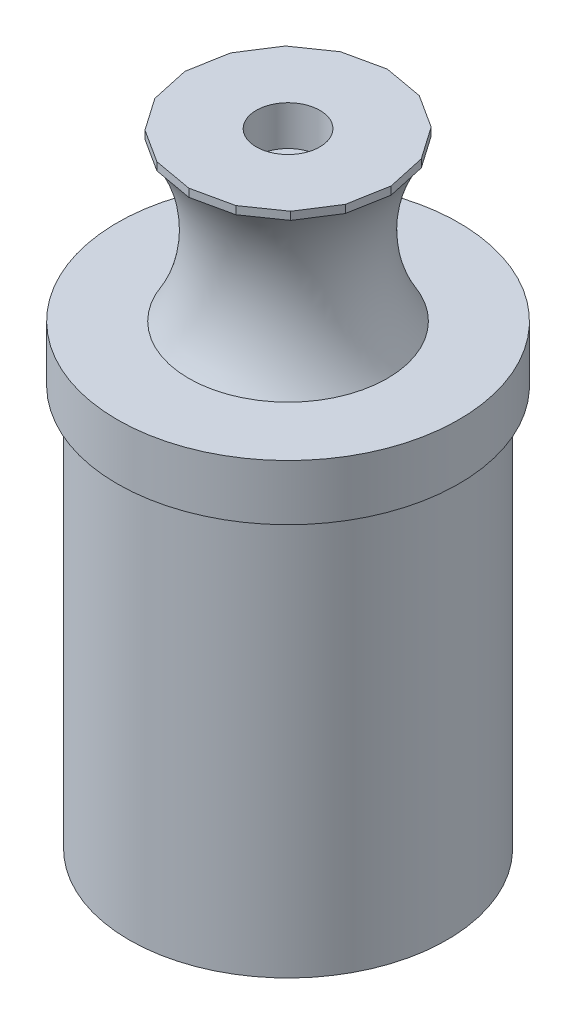
ISO-10303-21;
HEADER;
FILE_DESCRIPTION(('STEP AP214'),'2;1');
FILE_NAME('part.step','',(''),(''),'','','');
FILE_SCHEMA(('AUTOMOTIVE_DESIGN { 1 0 10303 214 1 1 1 1 }'));
ENDSEC;
DATA;
#1=APPLICATION_CONTEXT('core data for automotive mechanical design processes');
#2=APPLICATION_PROTOCOL_DEFINITION('international standard','automotive_design',2000,#1);
#3=PRODUCT_CONTEXT('',#1,'mechanical');
#4=PRODUCT('Part','Part','',(#3));
#5=PRODUCT_RELATED_PRODUCT_CATEGORY('part','',(#4));
#6=PRODUCT_DEFINITION_FORMATION('','',#4);
#7=PRODUCT_DEFINITION_CONTEXT('part definition',#1,'design');
#8=PRODUCT_DEFINITION('design','',#6,#7);
#9=PRODUCT_DEFINITION_SHAPE('','',#8);
#10=(LENGTH_UNIT() NAMED_UNIT(*) SI_UNIT(.MILLI.,.METRE.));
#11=(NAMED_UNIT(*) PLANE_ANGLE_UNIT() SI_UNIT($,.RADIAN.));
#12=(NAMED_UNIT(*) SI_UNIT($,.STERADIAN.) SOLID_ANGLE_UNIT());
#13=UNCERTAINTY_MEASURE_WITH_UNIT(LENGTH_MEASURE(1.E-05),#10,'distance_accuracy_value','');
#14=(GEOMETRIC_REPRESENTATION_CONTEXT(3) GLOBAL_UNCERTAINTY_ASSIGNED_CONTEXT((#13)) GLOBAL_UNIT_ASSIGNED_CONTEXT((#10,
#11,#12)) REPRESENTATION_CONTEXT('',''));
#15=CARTESIAN_POINT('',(0.,0.,0.));
#16=DIRECTION('',(0.,0.,1.));
#17=DIRECTION('',(1.,0.,0.));
#18=AXIS2_PLACEMENT_3D('',#15,#16,#17);
#19=CARTESIAN_POINT('',(0.,50.5,0.));
#20=DIRECTION('',(0.,-1.,0.));
#21=DIRECTION('',(0.,0.,-1.));
#22=AXIS2_PLACEMENT_3D('',#19,#20,#21);
#23=CYLINDRICAL_SURFACE('',#22,20.);
#24=CARTESIAN_POINT('',(0.,50.5,0.));
#25=DIRECTION('',(0.,1.,0.));
#26=DIRECTION('',(0.,0.,1.));
#27=AXIS2_PLACEMENT_3D('',#24,#25,#26);
#28=CIRCLE('',#27,20.);
#29=CARTESIAN_POINT('',(0.,50.5,20.));
#30=VERTEX_POINT('',#29);
#31=EDGE_CURVE('E11',#30,#30,#28,.T.);
#32=ORIENTED_EDGE('',*,*,#31,.F.);
#33=EDGE_LOOP('',(#32));
#34=FACE_BOUND('',#33,.T.);
#35=CARTESIAN_POINT('',(0.,0.,0.));
#36=DIRECTION('',(0.,1.,0.));
#37=DIRECTION('',(0.,0.,1.));
#38=AXIS2_PLACEMENT_3D('',#35,#36,#37);
#39=CIRCLE('',#38,20.);
#40=CARTESIAN_POINT('',(0.,0.,20.));
#41=VERTEX_POINT('',#40);
#42=EDGE_CURVE('E45',#41,#41,#39,.T.);
#43=ORIENTED_EDGE('',*,*,#42,.T.);
#44=EDGE_LOOP('',(#43));
#45=FACE_BOUND('',#44,.T.);
#46=ADVANCED_FACE('F42',(#34,#45),#23,.T.);
#47=CARTESIAN_POINT('',(0.,0.,0.));
#48=DIRECTION('',(0.,1.,0.));
#49=DIRECTION('',(0.,0.,1.));
#50=AXIS2_PLACEMENT_3D('',#47,#48,#49);
#51=PLANE('',#50);
#52=CARTESIAN_POINT('',(0.,0.,0.));
#53=DIRECTION('',(0.,-1.,0.));
#54=DIRECTION('',(0.,0.,-1.));
#55=AXIS2_PLACEMENT_3D('',#52,#53,#54);
#56=CIRCLE('',#55,5.);
#57=CARTESIAN_POINT('',(0.,0.,-5.));
#58=VERTEX_POINT('',#57);
#59=EDGE_CURVE('E297',#58,#58,#56,.T.);
#60=ORIENTED_EDGE('',*,*,#59,.F.);
#61=EDGE_LOOP('',(#60));
#62=FACE_BOUND('',#61,.T.);
#63=ORIENTED_EDGE('',*,*,#42,.F.);
#64=EDGE_LOOP('',(#63));
#65=FACE_BOUND('',#64,.T.);
#66=ADVANCED_FACE('F279',(#62,#65),#51,.F.);
#67=CARTESIAN_POINT('',(0.,57.5,0.));
#68=DIRECTION('',(0.,-1.,0.));
#69=DIRECTION('',(0.,0.,-1.));
#70=AXIS2_PLACEMENT_3D('',#67,#68,#69);
#71=CYLINDRICAL_SURFACE('',#70,21.5);
#72=CARTESIAN_POINT('',(0.,57.5,0.));
#73=DIRECTION('',(0.,1.,0.));
#74=DIRECTION('',(0.,0.,1.));
#75=AXIS2_PLACEMENT_3D('',#72,#73,#74);
#76=CIRCLE('',#75,21.5);
#77=CARTESIAN_POINT('',(0.,57.5,21.5));
#78=VERTEX_POINT('',#77);
#79=EDGE_CURVE('E252',#78,#78,#76,.T.);
#80=ORIENTED_EDGE('',*,*,#79,.F.);
#81=EDGE_LOOP('',(#80));
#82=FACE_BOUND('',#81,.T.);
#83=CARTESIAN_POINT('',(0.,50.5,0.));
#84=DIRECTION('',(0.,1.,0.));
#85=DIRECTION('',(0.,0.,1.));
#86=AXIS2_PLACEMENT_3D('',#83,#84,#85);
#87=CIRCLE('',#86,21.5);
#88=CARTESIAN_POINT('',(0.,50.5,21.5));
#89=VERTEX_POINT('',#88);
#90=EDGE_CURVE('E251',#89,#89,#87,.T.);
#91=ORIENTED_EDGE('',*,*,#90,.T.);
#92=EDGE_LOOP('',(#91));
#93=FACE_BOUND('',#92,.T.);
#94=ADVANCED_FACE('F260',(#82,#93),#71,.T.);
#95=CARTESIAN_POINT('',(0.,57.5,0.));
#96=DIRECTION('',(0.,1.,0.));
#97=DIRECTION('',(0.,0.,1.));
#98=AXIS2_PLACEMENT_3D('',#95,#96,#97);
#99=PLANE('',#98);
#100=CARTESIAN_POINT('',(0.,57.5,0.));
#101=DIRECTION('',(0.,-1.,0.));
#102=DIRECTION('',(0.,0.,-1.));
#103=AXIS2_PLACEMENT_3D('',#100,#101,#102);
#104=CIRCLE('',#103,12.5);
#105=CARTESIAN_POINT('',(0.,57.5,-12.5));
#106=VERTEX_POINT('',#105);
#107=EDGE_CURVE('E247',#106,#106,#104,.T.);
#108=ORIENTED_EDGE('',*,*,#107,.T.);
#109=EDGE_LOOP('',(#108));
#110=FACE_BOUND('',#109,.T.);
#111=ORIENTED_EDGE('',*,*,#79,.T.);
#112=EDGE_LOOP('',(#111));
#113=FACE_BOUND('',#112,.T.);
#114=ADVANCED_FACE('F265',(#110,#113),#99,.T.);
#115=CARTESIAN_POINT('',(0.,50.5,0.));
#116=DIRECTION('',(0.,1.,0.));
#117=DIRECTION('',(0.,0.,1.));
#118=AXIS2_PLACEMENT_3D('',#115,#116,#117);
#119=PLANE('',#118);
#120=ORIENTED_EDGE('',*,*,#31,.T.);
#121=EDGE_LOOP('',(#120));
#122=FACE_BOUND('',#121,.T.);
#123=ORIENTED_EDGE('',*,*,#90,.F.);
#124=EDGE_LOOP('',(#123));
#125=FACE_BOUND('',#124,.T.);
#126=ADVANCED_FACE('F262',(#122,#125),#119,.F.);
#127=CARTESIAN_POINT('',(0.,67.5,0.));
#128=DIRECTION('',(0.,-1.,0.));
#129=DIRECTION('',(0.,0.,-1.));
#130=AXIS2_PLACEMENT_3D('',#127,#128,#129);
#131=TOROIDAL_SURFACE('',#130,28.7845943383295,19.1098930599821);
#132=CARTESIAN_POINT('',(0.,77.5,0.));
#133=DIRECTION('',(0.,-1.,0.));
#134=DIRECTION('',(0.,0.,-1.));
#135=AXIS2_PLACEMENT_3D('',#132,#133,#134);
#136=CIRCLE('',#135,12.5);
#137=CARTESIAN_POINT('',(2.20885956121718,77.5,-12.3032897811447));
#138=VERTEX_POINT('',#137);
#139=CARTESIAN_POINT('',(6.7489853016312,77.5,-10.5214636528558));
#140=VERTEX_POINT('',#139);
#141=EDGE_CURVE('E240',#138,#140,#136,.T.);
#142=ORIENTED_EDGE('',*,*,#141,.T.);
#143=CARTESIAN_POINT('',(10.261639209576,77.5,-7.13784006072516));
#144=VERTEX_POINT('',#143);
#145=EDGE_CURVE('E65',#140,#144,#136,.T.);
#146=ORIENTED_EDGE('',*,*,#145,.T.);
#147=CARTESIAN_POINT('',(12.2120515698539,77.5,-2.66754502403037));
#148=VERTEX_POINT('',#147);
#149=EDGE_CURVE('E503',#144,#148,#136,.T.);
#150=ORIENTED_EDGE('',*,*,#149,.T.);
#151=CARTESIAN_POINT('',(12.3032897811447,77.5,2.20885956121718));
#152=VERTEX_POINT('',#151);
#153=EDGE_CURVE('E506',#148,#152,#136,.T.);
#154=ORIENTED_EDGE('',*,*,#153,.T.);
#155=CARTESIAN_POINT('',(10.5214636528558,77.5,6.7489853016312));
#156=VERTEX_POINT('',#155);
#157=EDGE_CURVE('E508',#152,#156,#136,.T.);
#158=ORIENTED_EDGE('',*,*,#157,.T.);
#159=CARTESIAN_POINT('',(7.13784006072516,77.5,10.261639209576));
#160=VERTEX_POINT('',#159);
#161=EDGE_CURVE('E511',#156,#160,#136,.T.);
#162=ORIENTED_EDGE('',*,*,#161,.T.);
#163=CARTESIAN_POINT('',(2.66754502403037,77.5,12.2120515698539));
#164=VERTEX_POINT('',#163);
#165=EDGE_CURVE('E514',#160,#164,#136,.T.);
#166=ORIENTED_EDGE('',*,*,#165,.T.);
#167=CARTESIAN_POINT('',(-2.20885956121718,77.5,12.3032897811447));
#168=VERTEX_POINT('',#167);
#169=EDGE_CURVE('E517',#164,#168,#136,.T.);
#170=ORIENTED_EDGE('',*,*,#169,.T.);
#171=CARTESIAN_POINT('',(-6.7489853016312,77.5,10.5214636528558));
#172=VERTEX_POINT('',#171);
#173=EDGE_CURVE('E520',#168,#172,#136,.T.);
#174=ORIENTED_EDGE('',*,*,#173,.T.);
#175=CARTESIAN_POINT('',(-10.261639209576,77.5,7.13784006072516));
#176=VERTEX_POINT('',#175);
#177=EDGE_CURVE('E523',#172,#176,#136,.T.);
#178=ORIENTED_EDGE('',*,*,#177,.T.);
#179=CARTESIAN_POINT('',(-12.2120515698539,77.5,2.66754502403037));
#180=VERTEX_POINT('',#179);
#181=EDGE_CURVE('E526',#176,#180,#136,.T.);
#182=ORIENTED_EDGE('',*,*,#181,.T.);
#183=CARTESIAN_POINT('',(-12.3032897811447,77.5,-2.20885956121718));
#184=VERTEX_POINT('',#183);
#185=EDGE_CURVE('E529',#180,#184,#136,.T.);
#186=ORIENTED_EDGE('',*,*,#185,.T.);
#187=CARTESIAN_POINT('',(-10.5214636528558,77.5,-6.74898530163119));
#188=VERTEX_POINT('',#187);
#189=EDGE_CURVE('E532',#184,#188,#136,.T.);
#190=ORIENTED_EDGE('',*,*,#189,.T.);
#191=CARTESIAN_POINT('',(-7.13784006072516,77.5,-10.261639209576));
#192=VERTEX_POINT('',#191);
#193=EDGE_CURVE('E535',#188,#192,#136,.T.);
#194=ORIENTED_EDGE('',*,*,#193,.T.);
#195=CARTESIAN_POINT('',(-2.66754502403037,77.5,-12.2120515698539));
#196=VERTEX_POINT('',#195);
#197=EDGE_CURVE('E238',#192,#196,#136,.T.);
#198=ORIENTED_EDGE('',*,*,#197,.T.);
#199=EDGE_CURVE('E233',#196,#138,#136,.T.);
#200=ORIENTED_EDGE('',*,*,#199,.T.);
#201=EDGE_LOOP('',(#142,#146,#150,#154,#158,#162,#166,#170,#174,#178,#182,#186,#190,#194,#198,#200));
#202=FACE_BOUND('',#201,.T.);
#203=ORIENTED_EDGE('',*,*,#107,.F.);
#204=EDGE_LOOP('',(#203));
#205=FACE_BOUND('',#204,.T.);
#206=ADVANCED_FACE('F264',(#202,#205),#131,.F.);
#207=CARTESIAN_POINT('',(0.,77.5,0.));
#208=DIRECTION('',(0.,1.,0.));
#209=DIRECTION('',(0.,0.,1.));
#210=AXIS2_PLACEMENT_3D('',#207,#208,#209);
#211=PLANE('',#210);
#212=ORIENTED_EDGE('',*,*,#141,.F.);
#213=DIRECTION('',(-0.984263182491576,0.,-0.176708764897374));
#214=VECTOR('',#213,1.);
#215=CARTESIAN_POINT('',(4.65613605814264,77.5,-11.8639202966138));
#216=LINE('',#215,#214);
#217=CARTESIAN_POINT('',(4.65613605814264,77.5,-11.8639202966138));
#218=VERTEX_POINT('',#217);
#219=EDGE_CURVE('E57',#218,#138,#216,.T.);
#220=ORIENTED_EDGE('',*,*,#219,.F.);
#221=DIRECTION('',(-0.841717092228465,0.,-0.539918824130496));
#222=VECTOR('',#221,1.);
#223=CARTESIAN_POINT('',(8.84183454511977,77.5,-9.17900700909784));
#224=LINE('',#223,#222);
#225=EDGE_CURVE('E356',#140,#218,#224,.T.);
#226=ORIENTED_EDGE('',*,*,#225,.F.);
#227=EDGE_LOOP('',(#212,#220,#226));
#228=FACE_BOUND('',#227,.T.);
#229=ADVANCED_FACE('F272',(#228),#211,.F.);
#230=ORIENTED_EDGE('',*,*,#145,.F.);
#231=CARTESIAN_POINT('',(8.84183454511977,77.5,-9.17900700909784));
#232=VERTEX_POINT('',#231);
#233=EDGE_CURVE('E357',#232,#140,#224,.T.);
#234=ORIENTED_EDGE('',*,*,#233,.F.);
#235=DIRECTION('',(-0.571027204858013,0.,-0.820931136766078));
#236=VECTOR('',#235,1.);
#237=CARTESIAN_POINT('',(11.6814438740322,77.5,-5.09667311235248));
#238=LINE('',#237,#236);
#239=EDGE_CURVE('E231',#144,#232,#238,.T.);
#240=ORIENTED_EDGE('',*,*,#239,.F.);
#241=EDGE_LOOP('',(#230,#234,#240));
#242=FACE_BOUND('',#241,.T.);
#243=ADVANCED_FACE('F573',(#242),#211,.F.);
#244=ORIENTED_EDGE('',*,*,#149,.F.);
#245=CARTESIAN_POINT('',(11.6814438740322,77.5,-5.09667311235248));
#246=VERTEX_POINT('',#245);
#247=EDGE_CURVE('E353',#246,#144,#238,.T.);
#248=ORIENTED_EDGE('',*,*,#247,.F.);
#249=DIRECTION('',(-0.21340360192243,0.,-0.976964125588311));
#250=VECTOR('',#249,1.);
#251=CARTESIAN_POINT('',(12.7426592656756,77.5,-0.238416935708264));
#252=LINE('',#251,#250);
#253=EDGE_CURVE('E423',#148,#246,#252,.T.);
#254=ORIENTED_EDGE('',*,*,#253,.F.);
#255=EDGE_LOOP('',(#244,#248,#254));
#256=FACE_BOUND('',#255,.T.);
#257=ADVANCED_FACE('F572',(#256),#211,.F.);
#258=ORIENTED_EDGE('',*,*,#153,.F.);
#259=CARTESIAN_POINT('',(12.7426592656756,77.5,-0.238416935708264));
#260=VERTEX_POINT('',#259);
#261=EDGE_CURVE('E227',#260,#148,#252,.T.);
#262=ORIENTED_EDGE('',*,*,#261,.F.);
#263=DIRECTION('',(0.176708764897375,0.,-0.984263182491576));
#264=VECTOR('',#263,1.);
#265=CARTESIAN_POINT('',(11.8639202966138,77.5,4.65613605814263));
#266=LINE('',#265,#264);
#267=EDGE_CURVE('E418',#152,#260,#266,.T.);
#268=ORIENTED_EDGE('',*,*,#267,.F.);
#269=EDGE_LOOP('',(#258,#262,#268));
#270=FACE_BOUND('',#269,.T.);
#271=ADVANCED_FACE('F580',(#270),#211,.F.);
#272=ORIENTED_EDGE('',*,*,#157,.F.);
#273=CARTESIAN_POINT('',(11.8639202966138,77.5,4.65613605814263));
#274=VERTEX_POINT('',#273);
#275=EDGE_CURVE('E419',#274,#152,#266,.T.);
#276=ORIENTED_EDGE('',*,*,#275,.F.);
#277=DIRECTION('',(0.539918824130496,0.,-0.841717092228465));
#278=VECTOR('',#277,1.);
#279=CARTESIAN_POINT('',(9.17900700909785,77.5,8.84183454511976));
#280=LINE('',#279,#278);
#281=EDGE_CURVE('E413',#156,#274,#280,.T.);
#282=ORIENTED_EDGE('',*,*,#281,.F.);
#283=EDGE_LOOP('',(#272,#276,#282));
#284=FACE_BOUND('',#283,.T.);
#285=ADVANCED_FACE('F687',(#284),#211,.F.);
#286=ORIENTED_EDGE('',*,*,#161,.F.);
#287=CARTESIAN_POINT('',(9.17900700909785,77.5,8.84183454511976));
#288=VERTEX_POINT('',#287);
#289=EDGE_CURVE('E414',#288,#156,#280,.T.);
#290=ORIENTED_EDGE('',*,*,#289,.F.);
#291=DIRECTION('',(0.820931136766078,0.,-0.571027204858013));
#292=VECTOR('',#291,1.);
#293=CARTESIAN_POINT('',(5.09667311235247,77.5,11.6814438740322));
#294=LINE('',#293,#292);
#295=EDGE_CURVE('E408',#160,#288,#294,.T.);
#296=ORIENTED_EDGE('',*,*,#295,.F.);
#297=EDGE_LOOP('',(#286,#290,#296));
#298=FACE_BOUND('',#297,.T.);
#299=ADVANCED_FACE('F691',(#298),#211,.F.);
#300=ORIENTED_EDGE('',*,*,#165,.F.);
#301=CARTESIAN_POINT('',(5.09667311235247,77.5,11.6814438740322));
#302=VERTEX_POINT('',#301);
#303=EDGE_CURVE('E409',#302,#160,#294,.T.);
#304=ORIENTED_EDGE('',*,*,#303,.F.);
#305=DIRECTION('',(0.976964125588311,0.,-0.21340360192243));
#306=VECTOR('',#305,1.);
#307=CARTESIAN_POINT('',(0.238416935708262,77.5,12.7426592656756));
#308=LINE('',#307,#306);
#309=EDGE_CURVE('E403',#164,#302,#308,.T.);
#310=ORIENTED_EDGE('',*,*,#309,.F.);
#311=EDGE_LOOP('',(#300,#304,#310));
#312=FACE_BOUND('',#311,.T.);
#313=ADVANCED_FACE('F693',(#312),#211,.F.);
#314=ORIENTED_EDGE('',*,*,#169,.F.);
#315=CARTESIAN_POINT('',(0.238416935708262,77.5,12.7426592656756));
#316=VERTEX_POINT('',#315);
#317=EDGE_CURVE('E404',#316,#164,#308,.T.);
#318=ORIENTED_EDGE('',*,*,#317,.F.);
#319=DIRECTION('',(0.984263182491576,0.,0.176708764897374));
#320=VECTOR('',#319,1.);
#321=CARTESIAN_POINT('',(-4.65613605814262,77.5,11.8639202966138));
#322=LINE('',#321,#320);
#323=EDGE_CURVE('E398',#168,#316,#322,.T.);
#324=ORIENTED_EDGE('',*,*,#323,.F.);
#325=EDGE_LOOP('',(#314,#318,#324));
#326=FACE_BOUND('',#325,.T.);
#327=ADVANCED_FACE('F695',(#326),#211,.F.);
#328=ORIENTED_EDGE('',*,*,#173,.F.);
#329=CARTESIAN_POINT('',(-4.65613605814262,77.5,11.8639202966138));
#330=VERTEX_POINT('',#329);
#331=EDGE_CURVE('E399',#330,#168,#322,.T.);
#332=ORIENTED_EDGE('',*,*,#331,.F.);
#333=DIRECTION('',(0.841717092228465,0.,0.539918824130496));
#334=VECTOR('',#333,1.);
#335=CARTESIAN_POINT('',(-8.84183454511975,77.5,9.17900700909784));
#336=LINE('',#335,#334);
#337=EDGE_CURVE('E393',#172,#330,#336,.T.);
#338=ORIENTED_EDGE('',*,*,#337,.F.);
#339=EDGE_LOOP('',(#328,#332,#338));
#340=FACE_BOUND('',#339,.T.);
#341=ADVANCED_FACE('F699',(#340),#211,.F.);
#342=ORIENTED_EDGE('',*,*,#177,.F.);
#343=CARTESIAN_POINT('',(-8.84183454511975,77.5,9.17900700909784));
#344=VERTEX_POINT('',#343);
#345=EDGE_CURVE('E394',#344,#172,#336,.T.);
#346=ORIENTED_EDGE('',*,*,#345,.F.);
#347=DIRECTION('',(0.571027204858013,0.,0.820931136766078));
#348=VECTOR('',#347,1.);
#349=CARTESIAN_POINT('',(-11.6814438740322,77.5,5.09667311235246));
#350=LINE('',#349,#348);
#351=EDGE_CURVE('E388',#176,#344,#350,.T.);
#352=ORIENTED_EDGE('',*,*,#351,.F.);
#353=EDGE_LOOP('',(#342,#346,#352));
#354=FACE_BOUND('',#353,.T.);
#355=ADVANCED_FACE('F653',(#354),#211,.F.);
#356=ORIENTED_EDGE('',*,*,#181,.F.);
#357=CARTESIAN_POINT('',(-11.6814438740322,77.5,5.09667311235246));
#358=VERTEX_POINT('',#357);
#359=EDGE_CURVE('E389',#358,#176,#350,.T.);
#360=ORIENTED_EDGE('',*,*,#359,.F.);
#361=DIRECTION('',(0.21340360192243,0.,0.976964125588311));
#362=VECTOR('',#361,1.);
#363=CARTESIAN_POINT('',(-12.7426592656756,77.5,0.238416935708261));
#364=LINE('',#363,#362);
#365=EDGE_CURVE('E383',#180,#358,#364,.T.);
#366=ORIENTED_EDGE('',*,*,#365,.F.);
#367=EDGE_LOOP('',(#356,#360,#366));
#368=FACE_BOUND('',#367,.T.);
#369=ADVANCED_FACE('F648',(#368),#211,.F.);
#370=ORIENTED_EDGE('',*,*,#185,.F.);
#371=CARTESIAN_POINT('',(-12.7426592656756,77.5,0.238416935708261));
#372=VERTEX_POINT('',#371);
#373=EDGE_CURVE('E384',#372,#180,#364,.T.);
#374=ORIENTED_EDGE('',*,*,#373,.F.);
#375=DIRECTION('',(-0.176708764897374,0.,0.984263182491576));
#376=VECTOR('',#375,1.);
#377=CARTESIAN_POINT('',(-11.8639202966138,77.5,-4.65613605814262));
#378=LINE('',#377,#376);
#379=EDGE_CURVE('E378',#184,#372,#378,.T.);
#380=ORIENTED_EDGE('',*,*,#379,.F.);
#381=EDGE_LOOP('',(#370,#374,#380));
#382=FACE_BOUND('',#381,.T.);
#383=ADVANCED_FACE('F644',(#382),#211,.F.);
#384=ORIENTED_EDGE('',*,*,#189,.F.);
#385=CARTESIAN_POINT('',(-11.8639202966138,77.5,-4.65613605814262));
#386=VERTEX_POINT('',#385);
#387=EDGE_CURVE('E379',#386,#184,#378,.T.);
#388=ORIENTED_EDGE('',*,*,#387,.F.);
#389=DIRECTION('',(-0.539918824130496,0.,0.841717092228465));
#390=VECTOR('',#389,1.);
#391=CARTESIAN_POINT('',(-9.17900700909784,77.5,-8.84183454511975));
#392=LINE('',#391,#390);
#393=EDGE_CURVE('E373',#188,#386,#392,.T.);
#394=ORIENTED_EDGE('',*,*,#393,.F.);
#395=EDGE_LOOP('',(#384,#388,#394));
#396=FACE_BOUND('',#395,.T.);
#397=ADVANCED_FACE('F545',(#396),#211,.F.);
#398=ORIENTED_EDGE('',*,*,#193,.F.);
#399=CARTESIAN_POINT('',(-9.17900700909784,77.5,-8.84183454511975));
#400=VERTEX_POINT('',#399);
#401=EDGE_CURVE('E374',#400,#188,#392,.T.);
#402=ORIENTED_EDGE('',*,*,#401,.F.);
#403=DIRECTION('',(-0.820931136766078,0.,0.571027204858013));
#404=VECTOR('',#403,1.);
#405=CARTESIAN_POINT('',(-5.09667311235247,77.5,-11.6814438740322));
#406=LINE('',#405,#404);
#407=EDGE_CURVE('E368',#192,#400,#406,.T.);
#408=ORIENTED_EDGE('',*,*,#407,.F.);
#409=EDGE_LOOP('',(#398,#402,#408));
#410=FACE_BOUND('',#409,.T.);
#411=ADVANCED_FACE('F542',(#410),#211,.F.);
#412=ORIENTED_EDGE('',*,*,#197,.F.);
#413=CARTESIAN_POINT('',(-5.09667311235247,77.5,-11.6814438740322));
#414=VERTEX_POINT('',#413);
#415=EDGE_CURVE('E369',#414,#192,#406,.T.);
#416=ORIENTED_EDGE('',*,*,#415,.F.);
#417=DIRECTION('',(-0.976964125588311,0.,0.21340360192243));
#418=VECTOR('',#417,1.);
#419=CARTESIAN_POINT('',(-0.238416935708264,77.5,-12.7426592656756));
#420=LINE('',#419,#418);
#421=EDGE_CURVE('E363',#196,#414,#420,.T.);
#422=ORIENTED_EDGE('',*,*,#421,.F.);
#423=EDGE_LOOP('',(#412,#416,#422));
#424=FACE_BOUND('',#423,.T.);
#425=ADVANCED_FACE('F491',(#424),#211,.F.);
#426=CARTESIAN_POINT('',(11.6814438740322,78.5,-5.09667311235248));
#427=DIRECTION('',(-0.820931136766078,0.,0.571027204858013));
#428=DIRECTION('',(0.571027204858013,0.,0.820931136766078));
#429=AXIS2_PLACEMENT_3D('',#426,#427,#428);
#430=PLANE('',#429);
#431=ORIENTED_EDGE('',*,*,#247,.T.);
#432=ORIENTED_EDGE('',*,*,#239,.T.);
#433=DIRECTION('',(0.,-1.,0.));
#434=VECTOR('',#433,1.);
#435=CARTESIAN_POINT('',(8.84183454511977,78.5,-9.17900700909784));
#436=LINE('',#435,#434);
#437=CARTESIAN_POINT('',(8.84183454511977,78.5,-9.17900700909784));
#438=VERTEX_POINT('',#437);
#439=EDGE_CURVE('E211',#438,#232,#436,.T.);
#440=ORIENTED_EDGE('',*,*,#439,.F.);
#441=DIRECTION('',(-0.571027204858013,0.,-0.820931136766078));
#442=VECTOR('',#441,1.);
#443=CARTESIAN_POINT('',(11.6814438740322,78.5,-5.09667311235248));
#444=LINE('',#443,#442);
#445=CARTESIAN_POINT('',(11.6814438740322,78.5,-5.09667311235248));
#446=VERTEX_POINT('',#445);
#447=EDGE_CURVE('E217',#446,#438,#444,.T.);
#448=ORIENTED_EDGE('',*,*,#447,.F.);
#449=DIRECTION('',(0.,-1.,0.));
#450=VECTOR('',#449,1.);
#451=CARTESIAN_POINT('',(11.6814438740322,78.5,-5.09667311235248));
#452=LINE('',#451,#450);
#453=EDGE_CURVE('E352',#446,#246,#452,.T.);
#454=ORIENTED_EDGE('',*,*,#453,.T.);
#455=EDGE_LOOP('',(#431,#432,#440,#448,#454));
#456=FACE_BOUND('',#455,.T.);
#457=ADVANCED_FACE('F230',(#456),#430,.F.);
#458=CARTESIAN_POINT('',(8.84183454511977,78.5,-9.17900700909784));
#459=DIRECTION('',(-0.539918824130496,0.,0.841717092228465));
#460=DIRECTION('',(0.841717092228465,0.,0.539918824130496));
#461=AXIS2_PLACEMENT_3D('',#458,#459,#460);
#462=PLANE('',#461);
#463=ORIENTED_EDGE('',*,*,#233,.T.);
#464=ORIENTED_EDGE('',*,*,#225,.T.);
#465=DIRECTION('',(0.,-1.,0.));
#466=VECTOR('',#465,1.);
#467=CARTESIAN_POINT('',(4.65613605814264,78.5,-11.8639202966138));
#468=LINE('',#467,#466);
#469=CARTESIAN_POINT('',(4.65613605814264,78.5,-11.8639202966138));
#470=VERTEX_POINT('',#469);
#471=EDGE_CURVE('E212',#470,#218,#468,.T.);
#472=ORIENTED_EDGE('',*,*,#471,.F.);
#473=DIRECTION('',(-0.841717092228465,0.,-0.539918824130496));
#474=VECTOR('',#473,1.);
#475=CARTESIAN_POINT('',(8.84183454511977,78.5,-9.17900700909784));
#476=LINE('',#475,#474);
#477=EDGE_CURVE('E206',#438,#470,#476,.T.);
#478=ORIENTED_EDGE('',*,*,#477,.F.);
#479=ORIENTED_EDGE('',*,*,#439,.T.);
#480=EDGE_LOOP('',(#463,#464,#472,#478,#479));
#481=FACE_BOUND('',#480,.T.);
#482=ADVANCED_FACE('F209',(#481),#462,.F.);
#483=CARTESIAN_POINT('',(4.65613605814264,78.5,-11.8639202966138));
#484=DIRECTION('',(-0.176708764897374,0.,0.984263182491576));
#485=DIRECTION('',(0.984263182491576,0.,0.176708764897374));
#486=AXIS2_PLACEMENT_3D('',#483,#484,#485);
#487=PLANE('',#486);
#488=ORIENTED_EDGE('',*,*,#219,.T.);
#489=CARTESIAN_POINT('',(-0.238416935708264,77.5,-12.7426592656756));
#490=VERTEX_POINT('',#489);
#491=EDGE_CURVE('E360',#138,#490,#216,.T.);
#492=ORIENTED_EDGE('',*,*,#491,.T.);
#493=DIRECTION('',(0.,-1.,0.));
#494=VECTOR('',#493,1.);
#495=CARTESIAN_POINT('',(-0.238416935708264,78.5,-12.7426592656756));
#496=LINE('',#495,#494);
#497=CARTESIAN_POINT('',(-0.238416935708264,78.5,-12.7426592656756));
#498=VERTEX_POINT('',#497);
#499=EDGE_CURVE('E241',#498,#490,#496,.T.);
#500=ORIENTED_EDGE('',*,*,#499,.F.);
#501=DIRECTION('',(-0.984263182491576,0.,-0.176708764897374));
#502=VECTOR('',#501,1.);
#503=CARTESIAN_POINT('',(4.65613605814264,78.5,-11.8639202966138));
#504=LINE('',#503,#502);
#505=EDGE_CURVE('E216',#470,#498,#504,.T.);
#506=ORIENTED_EDGE('',*,*,#505,.F.);
#507=ORIENTED_EDGE('',*,*,#471,.T.);
#508=EDGE_LOOP('',(#488,#492,#500,#506,#507));
#509=FACE_BOUND('',#508,.T.);
#510=ADVANCED_FACE('F499',(#509),#487,.F.);
#511=CARTESIAN_POINT('',(-0.238416935708264,78.5,-12.7426592656756));
#512=DIRECTION('',(0.21340360192243,0.,0.976964125588311));
#513=DIRECTION('',(0.976964125588311,0.,-0.21340360192243));
#514=AXIS2_PLACEMENT_3D('',#511,#512,#513);
#515=PLANE('',#514);
#516=EDGE_CURVE('E364',#490,#196,#420,.T.);
#517=ORIENTED_EDGE('',*,*,#516,.T.);
#518=ORIENTED_EDGE('',*,*,#421,.T.);
#519=DIRECTION('',(0.,-1.,0.));
#520=VECTOR('',#519,1.);
#521=CARTESIAN_POINT('',(-5.09667311235247,78.5,-11.6814438740322));
#522=LINE('',#521,#520);
#523=CARTESIAN_POINT('',(-5.09667311235247,78.5,-11.6814438740322));
#524=VERTEX_POINT('',#523);
#525=EDGE_CURVE('E473',#524,#414,#522,.T.);
#526=ORIENTED_EDGE('',*,*,#525,.F.);
#527=DIRECTION('',(-0.976964125588311,0.,0.21340360192243));
#528=VECTOR('',#527,1.);
#529=CARTESIAN_POINT('',(-0.238416935708264,78.5,-12.7426592656756));
#530=LINE('',#529,#528);
#531=EDGE_CURVE('E314',#498,#524,#530,.T.);
#532=ORIENTED_EDGE('',*,*,#531,.F.);
#533=ORIENTED_EDGE('',*,*,#499,.T.);
#534=EDGE_LOOP('',(#517,#518,#526,#532,#533));
#535=FACE_BOUND('',#534,.T.);
#536=ADVANCED_FACE('F482',(#535),#515,.F.);
#537=CARTESIAN_POINT('',(-5.09667311235247,78.5,-11.6814438740322));
#538=DIRECTION('',(0.571027204858013,0.,0.820931136766078));
#539=DIRECTION('',(0.820931136766078,0.,-0.571027204858013));
#540=AXIS2_PLACEMENT_3D('',#537,#538,#539);
#541=PLANE('',#540);
#542=ORIENTED_EDGE('',*,*,#415,.T.);
#543=ORIENTED_EDGE('',*,*,#407,.T.);
#544=DIRECTION('',(0.,-1.,0.));
#545=VECTOR('',#544,1.);
#546=CARTESIAN_POINT('',(-9.17900700909784,78.5,-8.84183454511975));
#547=LINE('',#546,#545);
#548=CARTESIAN_POINT('',(-9.17900700909784,78.5,-8.84183454511975));
#549=VERTEX_POINT('',#548);
#550=EDGE_CURVE('E469',#549,#400,#547,.T.);
#551=ORIENTED_EDGE('',*,*,#550,.F.);
#552=DIRECTION('',(-0.820931136766078,0.,0.571027204858013));
#553=VECTOR('',#552,1.);
#554=CARTESIAN_POINT('',(-5.09667311235247,78.5,-11.6814438740322));
#555=LINE('',#554,#553);
#556=EDGE_CURVE('E317',#524,#549,#555,.T.);
#557=ORIENTED_EDGE('',*,*,#556,.F.);
#558=ORIENTED_EDGE('',*,*,#525,.T.);
#559=EDGE_LOOP('',(#542,#543,#551,#557,#558));
#560=FACE_BOUND('',#559,.T.);
#561=ADVANCED_FACE('F555',(#560),#541,.F.);
#562=CARTESIAN_POINT('',(-9.17900700909784,78.5,-8.84183454511975));
#563=DIRECTION('',(0.841717092228465,0.,0.539918824130496));
#564=DIRECTION('',(0.539918824130496,0.,-0.841717092228465));
#565=AXIS2_PLACEMENT_3D('',#562,#563,#564);
#566=PLANE('',#565);
#567=ORIENTED_EDGE('',*,*,#401,.T.);
#568=ORIENTED_EDGE('',*,*,#393,.T.);
#569=DIRECTION('',(0.,-1.,0.));
#570=VECTOR('',#569,1.);
#571=CARTESIAN_POINT('',(-11.8639202966138,78.5,-4.65613605814262));
#572=LINE('',#571,#570);
#573=CARTESIAN_POINT('',(-11.8639202966138,78.5,-4.65613605814262));
#574=VERTEX_POINT('',#573);
#575=EDGE_CURVE('E465',#574,#386,#572,.T.);
#576=ORIENTED_EDGE('',*,*,#575,.F.);
#577=DIRECTION('',(-0.539918824130496,0.,0.841717092228465));
#578=VECTOR('',#577,1.);
#579=CARTESIAN_POINT('',(-9.17900700909784,78.5,-8.84183454511975));
#580=LINE('',#579,#578);
#581=EDGE_CURVE('E320',#549,#574,#580,.T.);
#582=ORIENTED_EDGE('',*,*,#581,.F.);
#583=ORIENTED_EDGE('',*,*,#550,.T.);
#584=EDGE_LOOP('',(#567,#568,#576,#582,#583));
#585=FACE_BOUND('',#584,.T.);
#586=ADVANCED_FACE('F550',(#585),#566,.F.);
#587=CARTESIAN_POINT('',(-11.8639202966138,78.5,-4.65613605814262));
#588=DIRECTION('',(0.984263182491576,0.,0.176708764897374));
#589=DIRECTION('',(0.176708764897374,0.,-0.984263182491576));
#590=AXIS2_PLACEMENT_3D('',#587,#588,#589);
#591=PLANE('',#590);
#592=ORIENTED_EDGE('',*,*,#387,.T.);
#593=ORIENTED_EDGE('',*,*,#379,.T.);
#594=DIRECTION('',(0.,-1.,0.));
#595=VECTOR('',#594,1.);
#596=CARTESIAN_POINT('',(-12.7426592656756,78.5,0.238416935708261));
#597=LINE('',#596,#595);
#598=CARTESIAN_POINT('',(-12.7426592656756,78.5,0.238416935708261));
#599=VERTEX_POINT('',#598);
#600=EDGE_CURVE('E461',#599,#372,#597,.T.);
#601=ORIENTED_EDGE('',*,*,#600,.F.);
#602=DIRECTION('',(-0.176708764897374,0.,0.984263182491576));
#603=VECTOR('',#602,1.);
#604=CARTESIAN_POINT('',(-11.8639202966138,78.5,-4.65613605814262));
#605=LINE('',#604,#603);
#606=EDGE_CURVE('E323',#574,#599,#605,.T.);
#607=ORIENTED_EDGE('',*,*,#606,.F.);
#608=ORIENTED_EDGE('',*,*,#575,.T.);
#609=EDGE_LOOP('',(#592,#593,#601,#607,#608));
#610=FACE_BOUND('',#609,.T.);
#611=ADVANCED_FACE('F619',(#610),#591,.F.);
#612=CARTESIAN_POINT('',(-12.7426592656756,78.5,0.238416935708261));
#613=DIRECTION('',(0.976964125588311,0.,-0.21340360192243));
#614=DIRECTION('',(-0.21340360192243,0.,-0.976964125588311));
#615=AXIS2_PLACEMENT_3D('',#612,#613,#614);
#616=PLANE('',#615);
#617=ORIENTED_EDGE('',*,*,#373,.T.);
#618=ORIENTED_EDGE('',*,*,#365,.T.);
#619=DIRECTION('',(0.,-1.,0.));
#620=VECTOR('',#619,1.);
#621=CARTESIAN_POINT('',(-11.6814438740322,78.5,5.09667311235246));
#622=LINE('',#621,#620);
#623=CARTESIAN_POINT('',(-11.6814438740322,78.5,5.09667311235246));
#624=VERTEX_POINT('',#623);
#625=EDGE_CURVE('E457',#624,#358,#622,.T.);
#626=ORIENTED_EDGE('',*,*,#625,.F.);
#627=DIRECTION('',(0.21340360192243,0.,0.976964125588311));
#628=VECTOR('',#627,1.);
#629=CARTESIAN_POINT('',(-12.7426592656756,78.5,0.238416935708261));
#630=LINE('',#629,#628);
#631=EDGE_CURVE('E326',#599,#624,#630,.T.);
#632=ORIENTED_EDGE('',*,*,#631,.F.);
#633=ORIENTED_EDGE('',*,*,#600,.T.);
#634=EDGE_LOOP('',(#617,#618,#626,#632,#633));
#635=FACE_BOUND('',#634,.T.);
#636=ADVANCED_FACE('F615',(#635),#616,.F.);
#637=CARTESIAN_POINT('',(-11.6814438740322,78.5,5.09667311235246));
#638=DIRECTION('',(0.820931136766078,0.,-0.571027204858013));
#639=DIRECTION('',(-0.571027204858013,0.,-0.820931136766078));
#640=AXIS2_PLACEMENT_3D('',#637,#638,#639);
#641=PLANE('',#640);
#642=ORIENTED_EDGE('',*,*,#359,.T.);
#643=ORIENTED_EDGE('',*,*,#351,.T.);
#644=DIRECTION('',(0.,-1.,0.));
#645=VECTOR('',#644,1.);
#646=CARTESIAN_POINT('',(-8.84183454511975,78.5,9.17900700909784));
#647=LINE('',#646,#645);
#648=CARTESIAN_POINT('',(-8.84183454511975,78.5,9.17900700909784));
#649=VERTEX_POINT('',#648);
#650=EDGE_CURVE('E453',#649,#344,#647,.T.);
#651=ORIENTED_EDGE('',*,*,#650,.F.);
#652=DIRECTION('',(0.571027204858013,0.,0.820931136766078));
#653=VECTOR('',#652,1.);
#654=CARTESIAN_POINT('',(-11.6814438740322,78.5,5.09667311235246));
#655=LINE('',#654,#653);
#656=EDGE_CURVE('E329',#624,#649,#655,.T.);
#657=ORIENTED_EDGE('',*,*,#656,.F.);
#658=ORIENTED_EDGE('',*,*,#625,.T.);
#659=EDGE_LOOP('',(#642,#643,#651,#657,#658));
#660=FACE_BOUND('',#659,.T.);
#661=ADVANCED_FACE('F611',(#660),#641,.F.);
#662=CARTESIAN_POINT('',(-8.84183454511975,78.5,9.17900700909784));
#663=DIRECTION('',(0.539918824130496,0.,-0.841717092228465));
#664=DIRECTION('',(-0.841717092228465,0.,-0.539918824130496));
#665=AXIS2_PLACEMENT_3D('',#662,#663,#664);
#666=PLANE('',#665);
#667=ORIENTED_EDGE('',*,*,#345,.T.);
#668=ORIENTED_EDGE('',*,*,#337,.T.);
#669=DIRECTION('',(0.,-1.,0.));
#670=VECTOR('',#669,1.);
#671=CARTESIAN_POINT('',(-4.65613605814262,78.5,11.8639202966138));
#672=LINE('',#671,#670);
#673=CARTESIAN_POINT('',(-4.65613605814262,78.5,11.8639202966138));
#674=VERTEX_POINT('',#673);
#675=EDGE_CURVE('E449',#674,#330,#672,.T.);
#676=ORIENTED_EDGE('',*,*,#675,.F.);
#677=DIRECTION('',(0.841717092228465,0.,0.539918824130496));
#678=VECTOR('',#677,1.);
#679=CARTESIAN_POINT('',(-8.84183454511975,78.5,9.17900700909784));
#680=LINE('',#679,#678);
#681=EDGE_CURVE('E332',#649,#674,#680,.T.);
#682=ORIENTED_EDGE('',*,*,#681,.F.);
#683=ORIENTED_EDGE('',*,*,#650,.T.);
#684=EDGE_LOOP('',(#667,#668,#676,#682,#683));
#685=FACE_BOUND('',#684,.T.);
#686=ADVANCED_FACE('F607',(#685),#666,.F.);
#687=CARTESIAN_POINT('',(-4.65613605814262,78.5,11.8639202966138));
#688=DIRECTION('',(0.176708764897374,0.,-0.984263182491576));
#689=DIRECTION('',(-0.984263182491576,0.,-0.176708764897374));
#690=AXIS2_PLACEMENT_3D('',#687,#688,#689);
#691=PLANE('',#690);
#692=ORIENTED_EDGE('',*,*,#331,.T.);
#693=ORIENTED_EDGE('',*,*,#323,.T.);
#694=DIRECTION('',(0.,-1.,0.));
#695=VECTOR('',#694,1.);
#696=CARTESIAN_POINT('',(0.238416935708262,78.5,12.7426592656756));
#697=LINE('',#696,#695);
#698=CARTESIAN_POINT('',(0.238416935708262,78.5,12.7426592656756));
#699=VERTEX_POINT('',#698);
#700=EDGE_CURVE('E445',#699,#316,#697,.T.);
#701=ORIENTED_EDGE('',*,*,#700,.F.);
#702=DIRECTION('',(0.984263182491576,0.,0.176708764897374));
#703=VECTOR('',#702,1.);
#704=CARTESIAN_POINT('',(-4.65613605814262,78.5,11.8639202966138));
#705=LINE('',#704,#703);
#706=EDGE_CURVE('E335',#674,#699,#705,.T.);
#707=ORIENTED_EDGE('',*,*,#706,.F.);
#708=ORIENTED_EDGE('',*,*,#675,.T.);
#709=EDGE_LOOP('',(#692,#693,#701,#707,#708));
#710=FACE_BOUND('',#709,.T.);
#711=ADVANCED_FACE('F603',(#710),#691,.F.);
#712=CARTESIAN_POINT('',(0.238416935708262,78.5,12.7426592656756));
#713=DIRECTION('',(-0.21340360192243,0.,-0.976964125588311));
#714=DIRECTION('',(-0.976964125588311,0.,0.21340360192243));
#715=AXIS2_PLACEMENT_3D('',#712,#713,#714);
#716=PLANE('',#715);
#717=ORIENTED_EDGE('',*,*,#317,.T.);
#718=ORIENTED_EDGE('',*,*,#309,.T.);
#719=DIRECTION('',(0.,-1.,0.));
#720=VECTOR('',#719,1.);
#721=CARTESIAN_POINT('',(5.09667311235247,78.5,11.6814438740322));
#722=LINE('',#721,#720);
#723=CARTESIAN_POINT('',(5.09667311235247,78.5,11.6814438740322));
#724=VERTEX_POINT('',#723);
#725=EDGE_CURVE('E441',#724,#302,#722,.T.);
#726=ORIENTED_EDGE('',*,*,#725,.F.);
#727=DIRECTION('',(0.976964125588311,0.,-0.21340360192243));
#728=VECTOR('',#727,1.);
#729=CARTESIAN_POINT('',(0.238416935708262,78.5,12.7426592656756));
#730=LINE('',#729,#728);
#731=EDGE_CURVE('E338',#699,#724,#730,.T.);
#732=ORIENTED_EDGE('',*,*,#731,.F.);
#733=ORIENTED_EDGE('',*,*,#700,.T.);
#734=EDGE_LOOP('',(#717,#718,#726,#732,#733));
#735=FACE_BOUND('',#734,.T.);
#736=ADVANCED_FACE('F599',(#735),#716,.F.);
#737=CARTESIAN_POINT('',(5.09667311235247,78.5,11.6814438740322));
#738=DIRECTION('',(-0.571027204858013,0.,-0.820931136766078));
#739=DIRECTION('',(-0.820931136766078,0.,0.571027204858013));
#740=AXIS2_PLACEMENT_3D('',#737,#738,#739);
#741=PLANE('',#740);
#742=ORIENTED_EDGE('',*,*,#303,.T.);
#743=ORIENTED_EDGE('',*,*,#295,.T.);
#744=DIRECTION('',(0.,-1.,0.));
#745=VECTOR('',#744,1.);
#746=CARTESIAN_POINT('',(9.17900700909785,78.5,8.84183454511976));
#747=LINE('',#746,#745);
#748=CARTESIAN_POINT('',(9.17900700909785,78.5,8.84183454511976));
#749=VERTEX_POINT('',#748);
#750=EDGE_CURVE('E437',#749,#288,#747,.T.);
#751=ORIENTED_EDGE('',*,*,#750,.F.);
#752=DIRECTION('',(0.820931136766078,0.,-0.571027204858013));
#753=VECTOR('',#752,1.);
#754=CARTESIAN_POINT('',(5.09667311235247,78.5,11.6814438740322));
#755=LINE('',#754,#753);
#756=EDGE_CURVE('E341',#724,#749,#755,.T.);
#757=ORIENTED_EDGE('',*,*,#756,.F.);
#758=ORIENTED_EDGE('',*,*,#725,.T.);
#759=EDGE_LOOP('',(#742,#743,#751,#757,#758));
#760=FACE_BOUND('',#759,.T.);
#761=ADVANCED_FACE('F595',(#760),#741,.F.);
#762=CARTESIAN_POINT('',(9.17900700909785,78.5,8.84183454511976));
#763=DIRECTION('',(-0.841717092228465,0.,-0.539918824130496));
#764=DIRECTION('',(-0.539918824130496,0.,0.841717092228465));
#765=AXIS2_PLACEMENT_3D('',#762,#763,#764);
#766=PLANE('',#765);
#767=ORIENTED_EDGE('',*,*,#289,.T.);
#768=ORIENTED_EDGE('',*,*,#281,.T.);
#769=DIRECTION('',(0.,-1.,0.));
#770=VECTOR('',#769,1.);
#771=CARTESIAN_POINT('',(11.8639202966138,78.5,4.65613605814263));
#772=LINE('',#771,#770);
#773=CARTESIAN_POINT('',(11.8639202966138,78.5,4.65613605814263));
#774=VERTEX_POINT('',#773);
#775=EDGE_CURVE('E433',#774,#274,#772,.T.);
#776=ORIENTED_EDGE('',*,*,#775,.F.);
#777=DIRECTION('',(0.539918824130496,0.,-0.841717092228465));
#778=VECTOR('',#777,1.);
#779=CARTESIAN_POINT('',(9.17900700909785,78.5,8.84183454511976));
#780=LINE('',#779,#778);
#781=EDGE_CURVE('E344',#749,#774,#780,.T.);
#782=ORIENTED_EDGE('',*,*,#781,.F.);
#783=ORIENTED_EDGE('',*,*,#750,.T.);
#784=EDGE_LOOP('',(#767,#768,#776,#782,#783));
#785=FACE_BOUND('',#784,.T.);
#786=ADVANCED_FACE('F591',(#785),#766,.F.);
#787=CARTESIAN_POINT('',(11.8639202966138,78.5,4.65613605814263));
#788=DIRECTION('',(-0.984263182491575,0.,-0.176708764897375));
#789=DIRECTION('',(-0.176708764897375,0.,0.984263182491576));
#790=AXIS2_PLACEMENT_3D('',#787,#788,#789);
#791=PLANE('',#790);
#792=ORIENTED_EDGE('',*,*,#275,.T.);
#793=ORIENTED_EDGE('',*,*,#267,.T.);
#794=DIRECTION('',(0.,-1.,0.));
#795=VECTOR('',#794,1.);
#796=CARTESIAN_POINT('',(12.7426592656756,78.5,-0.238416935708264));
#797=LINE('',#796,#795);
#798=CARTESIAN_POINT('',(12.7426592656756,78.5,-0.238416935708264));
#799=VERTEX_POINT('',#798);
#800=EDGE_CURVE('E429',#799,#260,#797,.T.);
#801=ORIENTED_EDGE('',*,*,#800,.F.);
#802=DIRECTION('',(0.176708764897375,0.,-0.984263182491576));
#803=VECTOR('',#802,1.);
#804=CARTESIAN_POINT('',(11.8639202966138,78.5,4.65613605814263));
#805=LINE('',#804,#803);
#806=EDGE_CURVE('E347',#774,#799,#805,.T.);
#807=ORIENTED_EDGE('',*,*,#806,.F.);
#808=ORIENTED_EDGE('',*,*,#775,.T.);
#809=EDGE_LOOP('',(#792,#793,#801,#807,#808));
#810=FACE_BOUND('',#809,.T.);
#811=ADVANCED_FACE('F588',(#810),#791,.F.);
#812=CARTESIAN_POINT('',(12.7426592656756,78.5,-0.238416935708264));
#813=DIRECTION('',(-0.976964125588311,0.,0.21340360192243));
#814=DIRECTION('',(0.21340360192243,0.,0.976964125588311));
#815=AXIS2_PLACEMENT_3D('',#812,#813,#814);
#816=PLANE('',#815);
#817=ORIENTED_EDGE('',*,*,#261,.T.);
#818=ORIENTED_EDGE('',*,*,#253,.T.);
#819=ORIENTED_EDGE('',*,*,#453,.F.);
#820=DIRECTION('',(-0.21340360192243,0.,-0.976964125588311));
#821=VECTOR('',#820,1.);
#822=CARTESIAN_POINT('',(12.7426592656756,78.5,-0.238416935708264));
#823=LINE('',#822,#821);
#824=EDGE_CURVE('E222',#799,#446,#823,.T.);
#825=ORIENTED_EDGE('',*,*,#824,.F.);
#826=ORIENTED_EDGE('',*,*,#800,.T.);
#827=EDGE_LOOP('',(#817,#818,#819,#825,#826));
#828=FACE_BOUND('',#827,.T.);
#829=ADVANCED_FACE('F568',(#828),#816,.F.);
#830=CARTESIAN_POINT('',(0.,78.5,0.));
#831=DIRECTION('',(0.,1.,0.));
#832=DIRECTION('',(0.,0.,1.));
#833=AXIS2_PLACEMENT_3D('',#830,#831,#832);
#834=PLANE('',#833);
#835=CARTESIAN_POINT('',(0.,78.5,0.));
#836=DIRECTION('',(0.,1.,0.));
#837=DIRECTION('',(0.,0.,1.));
#838=AXIS2_PLACEMENT_3D('',#835,#836,#837);
#839=CIRCLE('',#838,4.);
#840=CARTESIAN_POINT('',(0.,78.5,4.));
#841=VERTEX_POINT('',#840);
#842=EDGE_CURVE('E308',#841,#841,#839,.T.);
#843=ORIENTED_EDGE('',*,*,#842,.F.);
#844=EDGE_LOOP('',(#843));
#845=FACE_BOUND('',#844,.T.);
#846=ORIENTED_EDGE('',*,*,#447,.T.);
#847=ORIENTED_EDGE('',*,*,#477,.T.);
#848=ORIENTED_EDGE('',*,*,#505,.T.);
#849=ORIENTED_EDGE('',*,*,#531,.T.);
#850=ORIENTED_EDGE('',*,*,#556,.T.);
#851=ORIENTED_EDGE('',*,*,#581,.T.);
#852=ORIENTED_EDGE('',*,*,#606,.T.);
#853=ORIENTED_EDGE('',*,*,#631,.T.);
#854=ORIENTED_EDGE('',*,*,#656,.T.);
#855=ORIENTED_EDGE('',*,*,#681,.T.);
#856=ORIENTED_EDGE('',*,*,#706,.T.);
#857=ORIENTED_EDGE('',*,*,#731,.T.);
#858=ORIENTED_EDGE('',*,*,#756,.T.);
#859=ORIENTED_EDGE('',*,*,#781,.T.);
#860=ORIENTED_EDGE('',*,*,#806,.T.);
#861=ORIENTED_EDGE('',*,*,#824,.T.);
#862=EDGE_LOOP('',(#846,#847,#848,#849,#850,#851,#852,#853,#854,#855,#856,#857,#858,#859,#860,#861));
#863=FACE_BOUND('',#862,.T.);
#864=ADVANCED_FACE('F220',(#845,#863),#834,.T.);
#865=ORIENTED_EDGE('',*,*,#199,.F.);
#866=ORIENTED_EDGE('',*,*,#516,.F.);
#867=ORIENTED_EDGE('',*,*,#491,.F.);
#868=EDGE_LOOP('',(#865,#866,#867));
#869=FACE_BOUND('',#868,.T.);
#870=ADVANCED_FACE('F486',(#869),#211,.F.);
#871=CARTESIAN_POINT('',(0.,1.,0.));
#872=DIRECTION('',(0.,-1.,0.));
#873=DIRECTION('',(0.,0.,-1.));
#874=AXIS2_PLACEMENT_3D('',#871,#872,#873);
#875=CYLINDRICAL_SURFACE('',#874,5.);
#876=CARTESIAN_POINT('',(0.,1.,0.));
#877=DIRECTION('',(0.,-1.,0.));
#878=DIRECTION('',(0.,0.,-1.));
#879=AXIS2_PLACEMENT_3D('',#876,#877,#878);
#880=CIRCLE('',#879,5.);
#881=CARTESIAN_POINT('',(0.,1.,-5.));
#882=VERTEX_POINT('',#881);
#883=EDGE_CURVE('E300',#882,#882,#880,.T.);
#884=ORIENTED_EDGE('',*,*,#883,.F.);
#885=EDGE_LOOP('',(#884));
#886=FACE_BOUND('',#885,.T.);
#887=ORIENTED_EDGE('',*,*,#59,.T.);
#888=EDGE_LOOP('',(#887));
#889=FACE_BOUND('',#888,.T.);
#890=ADVANCED_FACE('F584',(#886,#889),#875,.F.);
#891=CARTESIAN_POINT('',(0.,1.,0.));
#892=DIRECTION('',(0.,-1.,0.));
#893=DIRECTION('',(0.,0.,-1.));
#894=AXIS2_PLACEMENT_3D('',#891,#892,#893);
#895=PLANE('',#894);
#896=ORIENTED_EDGE('',*,*,#883,.T.);
#897=EDGE_LOOP('',(#896));
#898=FACE_BOUND('',#897,.T.);
#899=ADVANCED_FACE('F790',(#898),#895,.T.);
#900=CARTESIAN_POINT('',(0.,73.5,0.));
#901=DIRECTION('',(0.,1.,0.));
#902=DIRECTION('',(0.,0.,1.));
#903=AXIS2_PLACEMENT_3D('',#900,#901,#902);
#904=CYLINDRICAL_SURFACE('',#903,4.);
#905=CARTESIAN_POINT('',(0.,73.5,0.));
#906=DIRECTION('',(0.,1.,0.));
#907=DIRECTION('',(0.,0.,1.));
#908=AXIS2_PLACEMENT_3D('',#905,#906,#907);
#909=CIRCLE('',#908,4.);
#910=CARTESIAN_POINT('',(0.,73.5,4.));
#911=VERTEX_POINT('',#910);
#912=EDGE_CURVE('E301',#911,#911,#909,.T.);
#913=ORIENTED_EDGE('',*,*,#912,.F.);
#914=EDGE_LOOP('',(#913));
#915=FACE_BOUND('',#914,.T.);
#916=ORIENTED_EDGE('',*,*,#842,.T.);
#917=EDGE_LOOP('',(#916));
#918=FACE_BOUND('',#917,.T.);
#919=ADVANCED_FACE('F800',(#915,#918),#904,.F.);
#920=CARTESIAN_POINT('',(0.,73.5,0.));
#921=DIRECTION('',(0.,1.,0.));
#922=DIRECTION('',(0.,0.,1.));
#923=AXIS2_PLACEMENT_3D('',#920,#921,#922);
#924=PLANE('',#923);
#925=ORIENTED_EDGE('',*,*,#912,.T.);
#926=EDGE_LOOP('',(#925));
#927=FACE_BOUND('',#926,.T.);
#928=ADVANCED_FACE('F817',(#927),#924,.T.);
#929=CLOSED_SHELL('',(#46,#66,#94,#114,#126,#206,#229,#243,#257,#271,#285,#299,#313,#327,#341,
#355,#369,#383,#397,#411,#425,#457,#482,#510,#536,#561,#586,#611,#636,#661,#686,#711,#736,#761,
#786,#811,#829,#864,#870,#890,#899,#919,#928));
#930=MANIFOLD_SOLID_BREP('B2',#929);
#931=ADVANCED_BREP_SHAPE_REPRESENTATION('',(#18,#930),#14);
#932=SHAPE_DEFINITION_REPRESENTATION(#9,#931);
ENDSEC;
END-ISO-10303-21;
